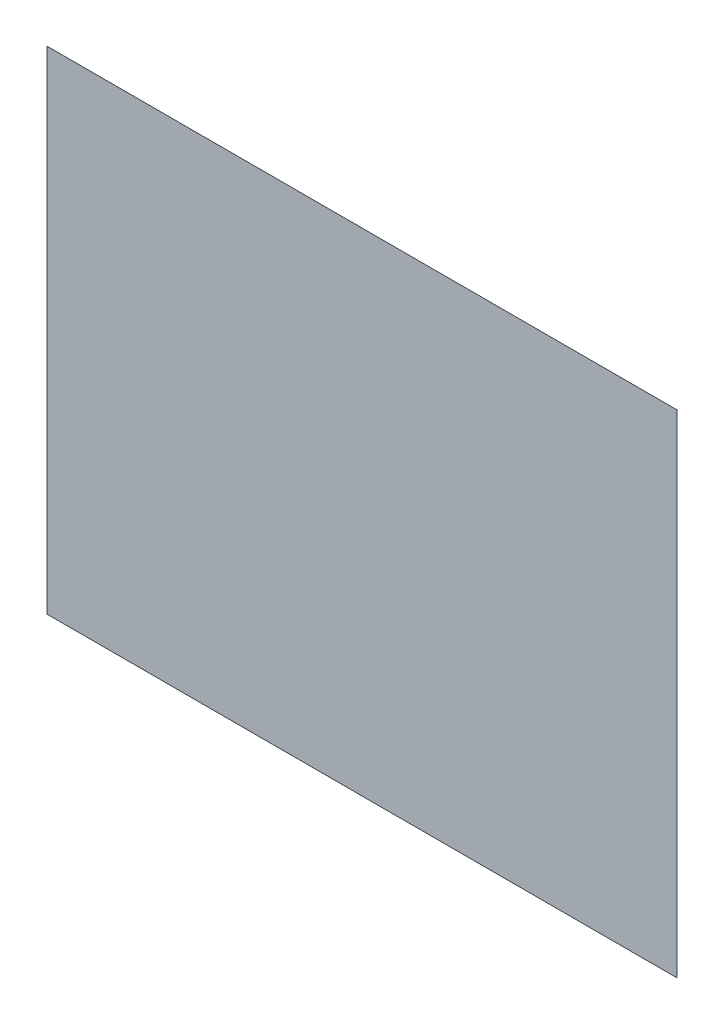
ISO-10303-21;
HEADER;
FILE_DESCRIPTION(('STEP AP214'),'2;1');
FILE_NAME('part.step','',(''),(''),'','','');
FILE_SCHEMA(('AUTOMOTIVE_DESIGN { 1 0 10303 214 1 1 1 1 }'));
ENDSEC;
DATA;
#1=APPLICATION_CONTEXT('core data for automotive mechanical design processes');
#2=APPLICATION_PROTOCOL_DEFINITION('international standard','automotive_design',2000,#1);
#3=PRODUCT_CONTEXT('',#1,'mechanical');
#4=PRODUCT('Part','Part','',(#3));
#5=PRODUCT_RELATED_PRODUCT_CATEGORY('part','',(#4));
#6=PRODUCT_DEFINITION_FORMATION('','',#4);
#7=PRODUCT_DEFINITION_CONTEXT('part definition',#1,'design');
#8=PRODUCT_DEFINITION('design','',#6,#7);
#9=PRODUCT_DEFINITION_SHAPE('','',#8);
#10=(LENGTH_UNIT() NAMED_UNIT(*) SI_UNIT(.MILLI.,.METRE.));
#11=(NAMED_UNIT(*) PLANE_ANGLE_UNIT() SI_UNIT($,.RADIAN.));
#12=(NAMED_UNIT(*) SI_UNIT($,.STERADIAN.) SOLID_ANGLE_UNIT());
#13=UNCERTAINTY_MEASURE_WITH_UNIT(LENGTH_MEASURE(1.E-05),#10,'distance_accuracy_value','');
#14=(GEOMETRIC_REPRESENTATION_CONTEXT(3) GLOBAL_UNCERTAINTY_ASSIGNED_CONTEXT((#13)) GLOBAL_UNIT_ASSIGNED_CONTEXT((#10,
#11,#12)) REPRESENTATION_CONTEXT('',''));
#15=CARTESIAN_POINT('',(0.,0.,0.));
#16=DIRECTION('',(0.,0.,1.));
#17=DIRECTION('',(1.,0.,0.));
#18=AXIS2_PLACEMENT_3D('',#15,#16,#17);
#19=CARTESIAN_POINT('',(0.,0.,0.));
#20=DIRECTION('',(0.,0.,1.));
#21=DIRECTION('',(1.,0.,0.));
#22=AXIS2_PLACEMENT_3D('',#19,#20,#21);
#23=PLANE('',#22);
#24=DIRECTION('',(0.,-1.,0.));
#25=VECTOR('',#24,1.);
#26=CARTESIAN_POINT('',(-22.49560366724,126.39617963739,0.));
#27=LINE('',#26,#25);
#28=CARTESIAN_POINT('',(-22.49560366724,126.39617963739,0.));
#29=VERTEX_POINT('',#28);
#30=CARTESIAN_POINT('',(-22.49560366724,1.39617963738999,0.));
#31=VERTEX_POINT('',#30);
#32=EDGE_CURVE('E173',#29,#31,#27,.T.);
#33=ORIENTED_EDGE('',*,*,#32,.F.);
#34=DIRECTION('',(-1.,0.,0.));
#35=VECTOR('',#34,1.);
#36=CARTESIAN_POINT('',(-22.49560366724,126.39617963739,0.));
#37=LINE('',#36,#35);
#38=CARTESIAN_POINT('',(112.50439633276,126.39617963739,0.));
#39=VERTEX_POINT('',#38);
#40=EDGE_CURVE('E12',#39,#29,#37,.T.);
#41=ORIENTED_EDGE('',*,*,#40,.F.);
#42=DIRECTION('',(0.,1.,0.));
#43=VECTOR('',#42,1.);
#44=CARTESIAN_POINT('',(112.50439633276,126.39617963739,0.));
#45=LINE('',#44,#43);
#46=CARTESIAN_POINT('',(112.50439633276,1.39617963738999,0.));
#47=VERTEX_POINT('',#46);
#48=EDGE_CURVE('E55',#47,#39,#45,.T.);
#49=ORIENTED_EDGE('',*,*,#48,.F.);
#50=DIRECTION('',(1.,0.,0.));
#51=VECTOR('',#50,1.);
#52=CARTESIAN_POINT('',(-22.49560366724,1.39617963738999,0.));
#53=LINE('',#52,#51);
#54=EDGE_CURVE('E63',#31,#47,#53,.T.);
#55=ORIENTED_EDGE('',*,*,#54,.F.);
#56=EDGE_LOOP('',(#33,#41,#49,#55));
#57=FACE_BOUND('',#56,.T.);
#58=ADVANCED_FACE('F45',(#57),#23,.F.);
#59=CARTESIAN_POINT('',(0.,0.,100.));
#60=DIRECTION('',(0.,0.,1.));
#61=DIRECTION('',(1.,0.,0.));
#62=AXIS2_PLACEMENT_3D('',#59,#60,#61);
#63=PLANE('',#62);
#64=DIRECTION('',(0.,-1.,0.));
#65=VECTOR('',#64,1.);
#66=CARTESIAN_POINT('',(-122.49560366724,226.39617963739,100.));
#67=LINE('',#66,#65);
#68=CARTESIAN_POINT('',(-122.49560366724,226.39617963739,100.));
#69=VERTEX_POINT('',#68);
#70=CARTESIAN_POINT('',(-122.49560366724,-35.00382036261,100.));
#71=VERTEX_POINT('',#70);
#72=EDGE_CURVE('E95',#69,#71,#67,.T.);
#73=ORIENTED_EDGE('',*,*,#72,.T.);
#74=DIRECTION('',(1.,0.,0.));
#75=VECTOR('',#74,1.);
#76=CARTESIAN_POINT('',(-122.49560366724,-35.00382036261,100.));
#77=LINE('',#76,#75);
#78=CARTESIAN_POINT('',(212.50439633276,-35.00382036261,100.));
#79=VERTEX_POINT('',#78);
#80=EDGE_CURVE('E114',#71,#79,#77,.T.);
#81=ORIENTED_EDGE('',*,*,#80,.T.);
#82=DIRECTION('',(0.,1.,0.));
#83=VECTOR('',#82,1.);
#84=CARTESIAN_POINT('',(212.50439633276,226.39617963739,100.));
#85=LINE('',#84,#83);
#86=CARTESIAN_POINT('',(212.50439633276,226.39617963739,100.));
#87=VERTEX_POINT('',#86);
#88=EDGE_CURVE('E97',#79,#87,#85,.T.);
#89=ORIENTED_EDGE('',*,*,#88,.T.);
#90=DIRECTION('',(-1.,0.,0.));
#91=VECTOR('',#90,1.);
#92=CARTESIAN_POINT('',(-122.49560366724,226.39617963739,100.));
#93=LINE('',#92,#91);
#94=EDGE_CURVE('E90',#87,#69,#93,.T.);
#95=ORIENTED_EDGE('',*,*,#94,.T.);
#96=EDGE_LOOP('',(#73,#81,#89,#95));
#97=FACE_BOUND('',#96,.T.);
#98=ADVANCED_FACE('F93',(#97),#63,.T.);
#99=CARTESIAN_POINT('',(0.,63.198089818695,-63.198089818695));
#100=DIRECTION('',(0.,-0.707106781186547,0.707106781186547));
#101=DIRECTION('',(0.,-0.707106781186548,-0.707106781186548));
#102=AXIS2_PLACEMENT_3D('',#99,#100,#101);
#103=PLANE('',#102);
#104=DIRECTION('',(-0.577350269189626,-0.577350269189626,-0.577350269189626));
#105=VECTOR('',#104,1.);
#106=CARTESIAN_POINT('',(212.50439633276,226.39617963739,100.));
#107=LINE('',#106,#105);
#108=EDGE_CURVE('E103',#87,#39,#107,.T.);
#109=ORIENTED_EDGE('',*,*,#108,.T.);
#110=ORIENTED_EDGE('',*,*,#40,.T.);
#111=DIRECTION('',(0.577350269189626,-0.577350269189626,-0.577350269189626));
#112=VECTOR('',#111,1.);
#113=CARTESIAN_POINT('',(-122.49560366724,226.39617963739,100.));
#114=LINE('',#113,#112);
#115=EDGE_CURVE('E111',#69,#29,#114,.T.);
#116=ORIENTED_EDGE('',*,*,#115,.F.);
#117=ORIENTED_EDGE('',*,*,#94,.F.);
#118=EDGE_LOOP('',(#109,#110,#116,#117));
#119=FACE_BOUND('',#118,.T.);
#120=ADVANCED_FACE('F118',(#119),#103,.F.);
#121=CARTESIAN_POINT('',(-11.24780183362,0.,-11.24780183362));
#122=DIRECTION('',(-0.707106781186548,0.,-0.707106781186548));
#123=DIRECTION('',(-0.707106781186548,0.,0.707106781186548));
#124=AXIS2_PLACEMENT_3D('',#121,#122,#123);
#125=PLANE('',#124);
#126=ORIENTED_EDGE('',*,*,#115,.T.);
#127=ORIENTED_EDGE('',*,*,#32,.T.);
#128=DIRECTION('',(0.684787599637451,0.249262686268032,-0.684787599637451));
#129=VECTOR('',#128,1.);
#130=CARTESIAN_POINT('',(-122.49560366724,-35.00382036261,100.));
#131=LINE('',#130,#129);
#132=EDGE_CURVE('E113',#71,#31,#131,.T.);
#133=ORIENTED_EDGE('',*,*,#132,.F.);
#134=ORIENTED_EDGE('',*,*,#72,.F.);
#135=EDGE_LOOP('',(#126,#127,#133,#134));
#136=FACE_BOUND('',#135,.T.);
#137=ADVANCED_FACE('F110',(#136),#125,.T.);
#138=CARTESIAN_POINT('',(56.25219816638,0.,-56.25219816638));
#139=DIRECTION('',(0.707106781186547,0.,-0.707106781186548));
#140=DIRECTION('',(-0.707106781186548,0.,-0.707106781186547));
#141=AXIS2_PLACEMENT_3D('',#138,#139,#140);
#142=PLANE('',#141);
#143=DIRECTION('',(-0.684787599637451,0.249262686268032,-0.684787599637451));
#144=VECTOR('',#143,1.);
#145=CARTESIAN_POINT('',(212.50439633276,-35.00382036261,100.));
#146=LINE('',#145,#144);
#147=EDGE_CURVE('E120',#79,#47,#146,.T.);
#148=ORIENTED_EDGE('',*,*,#147,.T.);
#149=ORIENTED_EDGE('',*,*,#48,.T.);
#150=ORIENTED_EDGE('',*,*,#108,.F.);
#151=ORIENTED_EDGE('',*,*,#88,.F.);
#152=EDGE_LOOP('',(#148,#149,#150,#151));
#153=FACE_BOUND('',#152,.T.);
#154=ADVANCED_FACE('F137',(#153),#142,.T.);
#155=CARTESIAN_POINT('',(0.,1.23283405627039,0.44875159648242));
#156=DIRECTION('',(0.,0.939683630956786,0.34204484166827));
#157=DIRECTION('',(0.,-0.34204484166827,0.939683630956785));
#158=AXIS2_PLACEMENT_3D('',#155,#156,#157);
#159=PLANE('',#158);
#160=ORIENTED_EDGE('',*,*,#132,.T.);
#161=ORIENTED_EDGE('',*,*,#54,.T.);
#162=ORIENTED_EDGE('',*,*,#147,.F.);
#163=ORIENTED_EDGE('',*,*,#80,.F.);
#164=EDGE_LOOP('',(#160,#161,#162,#163));
#165=FACE_BOUND('',#164,.T.);
#166=ADVANCED_FACE('F146',(#165),#159,.F.);
#167=CLOSED_SHELL('',(#58,#98,#120,#137,#154,#166));
#168=MANIFOLD_SOLID_BREP('B2',#167);
#169=ADVANCED_BREP_SHAPE_REPRESENTATION('',(#18,#168),#14);
#170=SHAPE_DEFINITION_REPRESENTATION(#9,#169);
ENDSEC;
END-ISO-10303-21;
